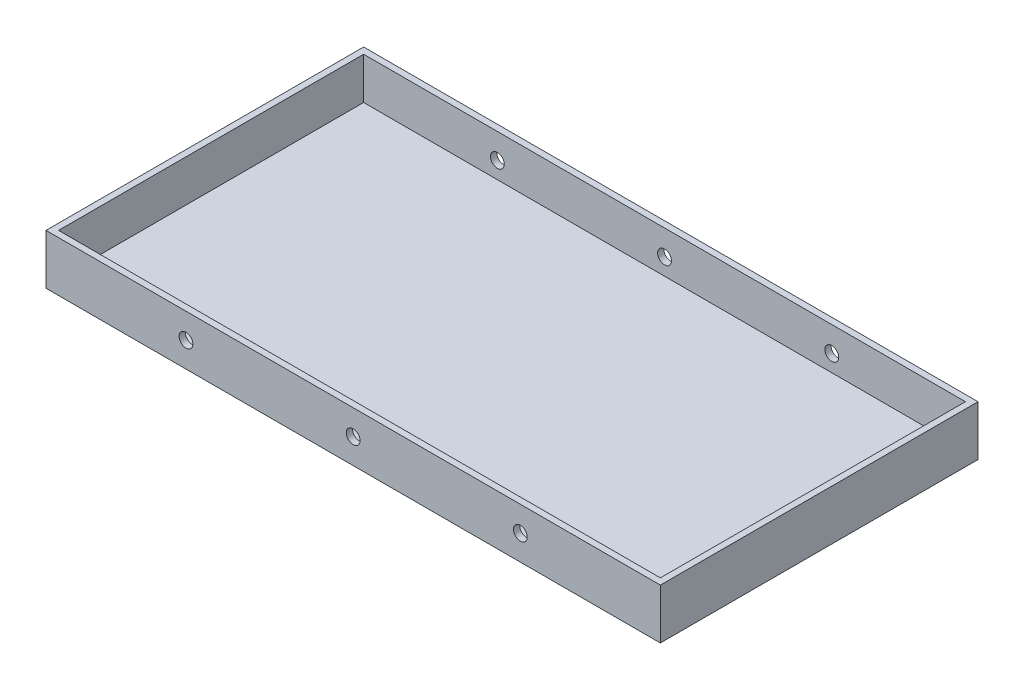
ISO-10303-21;
HEADER;
FILE_DESCRIPTION(('STEP AP214'),'2;1');
FILE_NAME('part.step','',(''),(''),'','','');
FILE_SCHEMA(('AUTOMOTIVE_DESIGN { 1 0 10303 214 1 1 1 1 }'));
ENDSEC;
DATA;
#1=APPLICATION_CONTEXT('core data for automotive mechanical design processes');
#2=APPLICATION_PROTOCOL_DEFINITION('international standard','automotive_design',2000,#1);
#3=PRODUCT_CONTEXT('',#1,'mechanical');
#4=PRODUCT('Part','Part','',(#3));
#5=PRODUCT_RELATED_PRODUCT_CATEGORY('part','',(#4));
#6=PRODUCT_DEFINITION_FORMATION('','',#4);
#7=PRODUCT_DEFINITION_CONTEXT('part definition',#1,'design');
#8=PRODUCT_DEFINITION('design','',#6,#7);
#9=PRODUCT_DEFINITION_SHAPE('','',#8);
#10=(LENGTH_UNIT() NAMED_UNIT(*) SI_UNIT(.MILLI.,.METRE.));
#11=(NAMED_UNIT(*) PLANE_ANGLE_UNIT() SI_UNIT($,.RADIAN.));
#12=(NAMED_UNIT(*) SI_UNIT($,.STERADIAN.) SOLID_ANGLE_UNIT());
#13=UNCERTAINTY_MEASURE_WITH_UNIT(LENGTH_MEASURE(1.E-05),#10,'distance_accuracy_value','');
#14=(GEOMETRIC_REPRESENTATION_CONTEXT(3) GLOBAL_UNCERTAINTY_ASSIGNED_CONTEXT((#13)) GLOBAL_UNIT_ASSIGNED_CONTEXT((#10,
#11,#12)) REPRESENTATION_CONTEXT('',''));
#15=CARTESIAN_POINT('',(0.,0.,0.));
#16=DIRECTION('',(0.,0.,1.));
#17=DIRECTION('',(1.,0.,0.));
#18=AXIS2_PLACEMENT_3D('',#15,#16,#17);
#19=CARTESIAN_POINT('',(0.,12.,0.));
#20=DIRECTION('',(1.,0.,0.));
#21=DIRECTION('',(0.,0.,-1.));
#22=AXIS2_PLACEMENT_3D('',#19,#20,#21);
#23=PLANE('',#22);
#24=DIRECTION('',(0.,0.,1.));
#25=VECTOR('',#24,1.);
#26=CARTESIAN_POINT('',(0.,0.,0.));
#27=LINE('',#26,#25);
#28=CARTESIAN_POINT('',(0.,0.,-76.));
#29=VERTEX_POINT('',#28);
#30=CARTESIAN_POINT('',(0.,0.,0.));
#31=VERTEX_POINT('',#30);
#32=EDGE_CURVE('E150',#29,#31,#27,.T.);
#33=ORIENTED_EDGE('',*,*,#32,.T.);
#34=DIRECTION('',(0.,-1.,0.));
#35=VECTOR('',#34,1.);
#36=CARTESIAN_POINT('',(0.,12.,0.));
#37=LINE('',#36,#35);
#38=CARTESIAN_POINT('',(0.,12.,0.));
#39=VERTEX_POINT('',#38);
#40=EDGE_CURVE('E12',#39,#31,#37,.T.);
#41=ORIENTED_EDGE('',*,*,#40,.F.);
#42=DIRECTION('',(0.,0.,1.));
#43=VECTOR('',#42,1.);
#44=CARTESIAN_POINT('',(0.,12.,0.));
#45=LINE('',#44,#43);
#46=CARTESIAN_POINT('',(0.,12.,-76.));
#47=VERTEX_POINT('',#46);
#48=EDGE_CURVE('E151',#47,#39,#45,.T.);
#49=ORIENTED_EDGE('',*,*,#48,.F.);
#50=DIRECTION('',(0.,-1.,0.));
#51=VECTOR('',#50,1.);
#52=CARTESIAN_POINT('',(0.,12.,-76.));
#53=LINE('',#52,#51);
#54=EDGE_CURVE('E157',#47,#29,#53,.T.);
#55=ORIENTED_EDGE('',*,*,#54,.T.);
#56=EDGE_LOOP('',(#33,#41,#49,#55));
#57=FACE_BOUND('',#56,.T.);
#58=ADVANCED_FACE('F37',(#57),#23,.F.);
#59=CARTESIAN_POINT('',(0.,12.,0.));
#60=DIRECTION('',(0.,0.,-1.));
#61=DIRECTION('',(-1.,0.,0.));
#62=AXIS2_PLACEMENT_3D('',#59,#60,#61);
#63=PLANE('',#62);
#64=CARTESIAN_POINT('',(113.5,6.,0.));
#65=DIRECTION('',(0.,0.,-1.));
#66=DIRECTION('',(-1.,0.,0.));
#67=AXIS2_PLACEMENT_3D('',#64,#65,#66);
#68=CIRCLE('',#67,1.65);
#69=CARTESIAN_POINT('',(111.85,6.,0.));
#70=VERTEX_POINT('',#69);
#71=EDGE_CURVE('E173',#70,#70,#68,.T.);
#72=ORIENTED_EDGE('',*,*,#71,.T.);
#73=EDGE_LOOP('',(#72));
#74=FACE_BOUND('',#73,.T.);
#75=CARTESIAN_POINT('',(33.5,6.,0.));
#76=DIRECTION('',(0.,0.,-1.));
#77=DIRECTION('',(1.,0.,0.));
#78=AXIS2_PLACEMENT_3D('',#75,#76,#77);
#79=CIRCLE('',#78,1.65);
#80=CARTESIAN_POINT('',(35.15,6.,0.));
#81=VERTEX_POINT('',#80);
#82=EDGE_CURVE('E250',#81,#81,#79,.T.);
#83=ORIENTED_EDGE('',*,*,#82,.T.);
#84=EDGE_LOOP('',(#83));
#85=FACE_BOUND('',#84,.T.);
#86=CARTESIAN_POINT('',(73.5,6.,0.));
#87=DIRECTION('',(0.,0.,-1.));
#88=DIRECTION('',(-1.,0.,0.));
#89=AXIS2_PLACEMENT_3D('',#86,#87,#88);
#90=CIRCLE('',#89,1.65);
#91=CARTESIAN_POINT('',(71.85,6.,0.));
#92=VERTEX_POINT('',#91);
#93=EDGE_CURVE('E246',#92,#92,#90,.T.);
#94=ORIENTED_EDGE('',*,*,#93,.T.);
#95=EDGE_LOOP('',(#94));
#96=FACE_BOUND('',#95,.T.);
#97=DIRECTION('',(1.,0.,0.));
#98=VECTOR('',#97,1.);
#99=CARTESIAN_POINT('',(0.,0.,0.));
#100=LINE('',#99,#98);
#101=CARTESIAN_POINT('',(147.,0.,0.));
#102=VERTEX_POINT('',#101);
#103=EDGE_CURVE('E160',#31,#102,#100,.T.);
#104=ORIENTED_EDGE('',*,*,#103,.T.);
#105=DIRECTION('',(0.,-1.,0.));
#106=VECTOR('',#105,1.);
#107=CARTESIAN_POINT('',(147.,12.,0.));
#108=LINE('',#107,#106);
#109=CARTESIAN_POINT('',(147.,12.,0.));
#110=VERTEX_POINT('',#109);
#111=EDGE_CURVE('E45',#110,#102,#108,.T.);
#112=ORIENTED_EDGE('',*,*,#111,.F.);
#113=DIRECTION('',(1.,0.,0.));
#114=VECTOR('',#113,1.);
#115=CARTESIAN_POINT('',(0.,12.,0.));
#116=LINE('',#115,#114);
#117=EDGE_CURVE('E90',#39,#110,#116,.T.);
#118=ORIENTED_EDGE('',*,*,#117,.F.);
#119=ORIENTED_EDGE('',*,*,#40,.T.);
#120=EDGE_LOOP('',(#104,#112,#118,#119));
#121=FACE_BOUND('',#120,.T.);
#122=ADVANCED_FACE('F206',(#74,#85,#96,#121),#63,.F.);
#123=CARTESIAN_POINT('',(147.,12.,0.));
#124=DIRECTION('',(-1.,0.,0.));
#125=DIRECTION('',(0.,0.,1.));
#126=AXIS2_PLACEMENT_3D('',#123,#124,#125);
#127=PLANE('',#126);
#128=DIRECTION('',(0.,0.,-1.));
#129=VECTOR('',#128,1.);
#130=CARTESIAN_POINT('',(147.,0.,0.));
#131=LINE('',#130,#129);
#132=CARTESIAN_POINT('',(147.,0.,-76.));
#133=VERTEX_POINT('',#132);
#134=EDGE_CURVE('E162',#102,#133,#131,.T.);
#135=ORIENTED_EDGE('',*,*,#134,.T.);
#136=DIRECTION('',(0.,-1.,0.));
#137=VECTOR('',#136,1.);
#138=CARTESIAN_POINT('',(147.,12.,-76.));
#139=LINE('',#138,#137);
#140=CARTESIAN_POINT('',(147.,12.,-76.));
#141=VERTEX_POINT('',#140);
#142=EDGE_CURVE('E166',#141,#133,#139,.T.);
#143=ORIENTED_EDGE('',*,*,#142,.F.);
#144=DIRECTION('',(0.,0.,-1.));
#145=VECTOR('',#144,1.);
#146=CARTESIAN_POINT('',(147.,12.,0.));
#147=LINE('',#146,#145);
#148=EDGE_CURVE('E154',#110,#141,#147,.T.);
#149=ORIENTED_EDGE('',*,*,#148,.F.);
#150=ORIENTED_EDGE('',*,*,#111,.T.);
#151=EDGE_LOOP('',(#135,#143,#149,#150));
#152=FACE_BOUND('',#151,.T.);
#153=ADVANCED_FACE('F211',(#152),#127,.F.);
#154=CARTESIAN_POINT('',(0.,12.,-76.));
#155=DIRECTION('',(0.,0.,1.));
#156=DIRECTION('',(1.,0.,0.));
#157=AXIS2_PLACEMENT_3D('',#154,#155,#156);
#158=PLANE('',#157);
#159=CARTESIAN_POINT('',(113.5,6.,-76.));
#160=DIRECTION('',(0.,0.,-1.));
#161=DIRECTION('',(-1.,0.,0.));
#162=AXIS2_PLACEMENT_3D('',#159,#160,#161);
#163=CIRCLE('',#162,1.65);
#164=CARTESIAN_POINT('',(111.85,6.,-76.));
#165=VERTEX_POINT('',#164);
#166=EDGE_CURVE('E238',#165,#165,#163,.T.);
#167=ORIENTED_EDGE('',*,*,#166,.F.);
#168=EDGE_LOOP('',(#167));
#169=FACE_BOUND('',#168,.T.);
#170=CARTESIAN_POINT('',(33.5,6.,-76.));
#171=DIRECTION('',(0.,0.,-1.));
#172=DIRECTION('',(1.,0.,0.));
#173=AXIS2_PLACEMENT_3D('',#170,#171,#172);
#174=CIRCLE('',#173,1.65);
#175=CARTESIAN_POINT('',(35.15,6.,-76.));
#176=VERTEX_POINT('',#175);
#177=EDGE_CURVE('E242',#176,#176,#174,.T.);
#178=ORIENTED_EDGE('',*,*,#177,.F.);
#179=EDGE_LOOP('',(#178));
#180=FACE_BOUND('',#179,.T.);
#181=CARTESIAN_POINT('',(73.5,6.,-76.));
#182=DIRECTION('',(0.,0.,-1.));
#183=DIRECTION('',(-1.,0.,0.));
#184=AXIS2_PLACEMENT_3D('',#181,#182,#183);
#185=CIRCLE('',#184,1.65);
#186=CARTESIAN_POINT('',(71.85,6.,-76.));
#187=VERTEX_POINT('',#186);
#188=EDGE_CURVE('E186',#187,#187,#185,.T.);
#189=ORIENTED_EDGE('',*,*,#188,.F.);
#190=EDGE_LOOP('',(#189));
#191=FACE_BOUND('',#190,.T.);
#192=DIRECTION('',(-1.,0.,0.));
#193=VECTOR('',#192,1.);
#194=CARTESIAN_POINT('',(0.,0.,-76.));
#195=LINE('',#194,#193);
#196=EDGE_CURVE('E83',#133,#29,#195,.T.);
#197=ORIENTED_EDGE('',*,*,#196,.T.);
#198=ORIENTED_EDGE('',*,*,#54,.F.);
#199=DIRECTION('',(-1.,0.,0.));
#200=VECTOR('',#199,1.);
#201=CARTESIAN_POINT('',(0.,12.,-76.));
#202=LINE('',#201,#200);
#203=EDGE_CURVE('E62',#141,#47,#202,.T.);
#204=ORIENTED_EDGE('',*,*,#203,.F.);
#205=ORIENTED_EDGE('',*,*,#142,.T.);
#206=EDGE_LOOP('',(#197,#198,#204,#205));
#207=FACE_BOUND('',#206,.T.);
#208=ADVANCED_FACE('F200',(#169,#180,#191,#207),#158,.F.);
#209=CARTESIAN_POINT('',(0.,12.,0.));
#210=DIRECTION('',(0.,-1.,0.));
#211=DIRECTION('',(0.,0.,-1.));
#212=AXIS2_PLACEMENT_3D('',#209,#210,#211);
#213=PLANE('',#212);
#214=DIRECTION('',(1.,0.,0.));
#215=VECTOR('',#214,1.);
#216=CARTESIAN_POINT('',(1.5,12.,-1.5));
#217=LINE('',#216,#215);
#218=CARTESIAN_POINT('',(1.5,12.,-1.5));
#219=VERTEX_POINT('',#218);
#220=CARTESIAN_POINT('',(145.5,12.,-1.5));
#221=VERTEX_POINT('',#220);
#222=EDGE_CURVE('E136',#219,#221,#217,.T.);
#223=ORIENTED_EDGE('',*,*,#222,.F.);
#224=DIRECTION('',(0.,0.,1.));
#225=VECTOR('',#224,1.);
#226=CARTESIAN_POINT('',(1.5,12.,-74.5));
#227=LINE('',#226,#225);
#228=CARTESIAN_POINT('',(1.5,12.,-74.5));
#229=VERTEX_POINT('',#228);
#230=EDGE_CURVE('E129',#229,#219,#227,.T.);
#231=ORIENTED_EDGE('',*,*,#230,.F.);
#232=DIRECTION('',(-1.,0.,0.));
#233=VECTOR('',#232,1.);
#234=CARTESIAN_POINT('',(145.5,12.,-74.5));
#235=LINE('',#234,#233);
#236=CARTESIAN_POINT('',(145.5,12.,-74.5));
#237=VERTEX_POINT('',#236);
#238=EDGE_CURVE('E140',#237,#229,#235,.T.);
#239=ORIENTED_EDGE('',*,*,#238,.F.);
#240=DIRECTION('',(0.,0.,-1.));
#241=VECTOR('',#240,1.);
#242=CARTESIAN_POINT('',(145.5,12.,-1.5));
#243=LINE('',#242,#241);
#244=EDGE_CURVE('E53',#221,#237,#243,.T.);
#245=ORIENTED_EDGE('',*,*,#244,.F.);
#246=EDGE_LOOP('',(#223,#231,#239,#245));
#247=FACE_BOUND('',#246,.T.);
#248=ORIENTED_EDGE('',*,*,#48,.T.);
#249=ORIENTED_EDGE('',*,*,#117,.T.);
#250=ORIENTED_EDGE('',*,*,#148,.T.);
#251=ORIENTED_EDGE('',*,*,#203,.T.);
#252=EDGE_LOOP('',(#248,#249,#250,#251));
#253=FACE_BOUND('',#252,.T.);
#254=ADVANCED_FACE('F197',(#247,#253),#213,.F.);
#255=CARTESIAN_POINT('',(0.,0.,0.));
#256=DIRECTION('',(0.,-1.,0.));
#257=DIRECTION('',(0.,0.,-1.));
#258=AXIS2_PLACEMENT_3D('',#255,#256,#257);
#259=PLANE('',#258);
#260=ORIENTED_EDGE('',*,*,#32,.F.);
#261=ORIENTED_EDGE('',*,*,#196,.F.);
#262=ORIENTED_EDGE('',*,*,#134,.F.);
#263=ORIENTED_EDGE('',*,*,#103,.F.);
#264=EDGE_LOOP('',(#260,#261,#262,#263));
#265=FACE_BOUND('',#264,.T.);
#266=ADVANCED_FACE('F199',(#265),#259,.T.);
#267=CARTESIAN_POINT('',(0.,2.,0.));
#268=DIRECTION('',(0.,-1.,0.));
#269=DIRECTION('',(0.,0.,-1.));
#270=AXIS2_PLACEMENT_3D('',#267,#268,#269);
#271=PLANE('',#270);
#272=DIRECTION('',(-1.,0.,0.));
#273=VECTOR('',#272,1.);
#274=CARTESIAN_POINT('',(145.5,2.,-74.5));
#275=LINE('',#274,#273);
#276=CARTESIAN_POINT('',(145.5,2.,-74.5));
#277=VERTEX_POINT('',#276);
#278=CARTESIAN_POINT('',(1.5,2.,-74.5));
#279=VERTEX_POINT('',#278);
#280=EDGE_CURVE('E133',#277,#279,#275,.T.);
#281=ORIENTED_EDGE('',*,*,#280,.T.);
#282=DIRECTION('',(0.,0.,1.));
#283=VECTOR('',#282,1.);
#284=CARTESIAN_POINT('',(1.5,2.,-74.5));
#285=LINE('',#284,#283);
#286=CARTESIAN_POINT('',(1.5,2.,-1.5));
#287=VERTEX_POINT('',#286);
#288=EDGE_CURVE('E126',#279,#287,#285,.T.);
#289=ORIENTED_EDGE('',*,*,#288,.T.);
#290=DIRECTION('',(1.,0.,0.));
#291=VECTOR('',#290,1.);
#292=CARTESIAN_POINT('',(1.5,2.,-1.5));
#293=LINE('',#292,#291);
#294=CARTESIAN_POINT('',(145.5,2.,-1.5));
#295=VERTEX_POINT('',#294);
#296=EDGE_CURVE('E113',#287,#295,#293,.T.);
#297=ORIENTED_EDGE('',*,*,#296,.T.);
#298=DIRECTION('',(0.,0.,-1.));
#299=VECTOR('',#298,1.);
#300=CARTESIAN_POINT('',(145.5,2.,-1.5));
#301=LINE('',#300,#299);
#302=EDGE_CURVE('E145',#295,#277,#301,.T.);
#303=ORIENTED_EDGE('',*,*,#302,.T.);
#304=EDGE_LOOP('',(#281,#289,#297,#303));
#305=FACE_BOUND('',#304,.T.);
#306=ADVANCED_FACE('F132',(#305),#271,.F.);
#307=CARTESIAN_POINT('',(1.5,-161.446585594122,-74.5));
#308=DIRECTION('',(-1.,0.,0.));
#309=DIRECTION('',(0.,0.,1.));
#310=AXIS2_PLACEMENT_3D('',#307,#308,#309);
#311=PLANE('',#310);
#312=DIRECTION('',(0.,1.,0.));
#313=VECTOR('',#312,1.);
#314=CARTESIAN_POINT('',(1.5,-161.446585594122,-74.5));
#315=LINE('',#314,#313);
#316=EDGE_CURVE('E143',#279,#229,#315,.T.);
#317=ORIENTED_EDGE('',*,*,#316,.T.);
#318=ORIENTED_EDGE('',*,*,#230,.T.);
#319=DIRECTION('',(0.,1.,0.));
#320=VECTOR('',#319,1.);
#321=CARTESIAN_POINT('',(1.5,-161.446585594122,-1.5));
#322=LINE('',#321,#320);
#323=EDGE_CURVE('E117',#287,#219,#322,.T.);
#324=ORIENTED_EDGE('',*,*,#323,.F.);
#325=ORIENTED_EDGE('',*,*,#288,.F.);
#326=EDGE_LOOP('',(#317,#318,#324,#325));
#327=FACE_BOUND('',#326,.T.);
#328=ADVANCED_FACE('F125',(#327),#311,.F.);
#329=CARTESIAN_POINT('',(1.5,-161.446585594122,-1.5));
#330=DIRECTION('',(0.,0.,1.));
#331=DIRECTION('',(1.,0.,0.));
#332=AXIS2_PLACEMENT_3D('',#329,#330,#331);
#333=PLANE('',#332);
#334=CARTESIAN_POINT('',(113.5,6.,-1.5));
#335=DIRECTION('',(0.,0.,1.));
#336=DIRECTION('',(1.,0.,0.));
#337=AXIS2_PLACEMENT_3D('',#334,#335,#336);
#338=CIRCLE('',#337,1.65);
#339=CARTESIAN_POINT('',(115.15,6.,-1.5));
#340=VERTEX_POINT('',#339);
#341=EDGE_CURVE('E189',#340,#340,#338,.T.);
#342=ORIENTED_EDGE('',*,*,#341,.T.);
#343=EDGE_LOOP('',(#342));
#344=FACE_BOUND('',#343,.T.);
#345=CARTESIAN_POINT('',(33.5,6.,-1.5));
#346=DIRECTION('',(0.,0.,1.));
#347=DIRECTION('',(1.,0.,0.));
#348=AXIS2_PLACEMENT_3D('',#345,#346,#347);
#349=CIRCLE('',#348,1.65);
#350=CARTESIAN_POINT('',(35.15,6.,-1.5));
#351=VERTEX_POINT('',#350);
#352=EDGE_CURVE('E176',#351,#351,#349,.T.);
#353=ORIENTED_EDGE('',*,*,#352,.T.);
#354=EDGE_LOOP('',(#353));
#355=FACE_BOUND('',#354,.T.);
#356=CARTESIAN_POINT('',(73.5,6.,-1.5));
#357=DIRECTION('',(0.,0.,1.));
#358=DIRECTION('',(1.,0.,0.));
#359=AXIS2_PLACEMENT_3D('',#356,#357,#358);
#360=CIRCLE('',#359,1.65);
#361=CARTESIAN_POINT('',(75.15,6.,-1.5));
#362=VERTEX_POINT('',#361);
#363=EDGE_CURVE('E172',#362,#362,#360,.T.);
#364=ORIENTED_EDGE('',*,*,#363,.T.);
#365=EDGE_LOOP('',(#364));
#366=FACE_BOUND('',#365,.T.);
#367=ORIENTED_EDGE('',*,*,#323,.T.);
#368=ORIENTED_EDGE('',*,*,#222,.T.);
#369=DIRECTION('',(0.,1.,0.));
#370=VECTOR('',#369,1.);
#371=CARTESIAN_POINT('',(145.5,-161.446585594122,-1.5));
#372=LINE('',#371,#370);
#373=EDGE_CURVE('E119',#295,#221,#372,.T.);
#374=ORIENTED_EDGE('',*,*,#373,.F.);
#375=ORIENTED_EDGE('',*,*,#296,.F.);
#376=EDGE_LOOP('',(#367,#368,#374,#375));
#377=FACE_BOUND('',#376,.T.);
#378=ADVANCED_FACE('F115',(#344,#355,#366,#377),#333,.F.);
#379=CARTESIAN_POINT('',(145.5,-161.446585594122,-1.5));
#380=DIRECTION('',(1.,0.,0.));
#381=DIRECTION('',(0.,0.,-1.));
#382=AXIS2_PLACEMENT_3D('',#379,#380,#381);
#383=PLANE('',#382);
#384=ORIENTED_EDGE('',*,*,#373,.T.);
#385=ORIENTED_EDGE('',*,*,#244,.T.);
#386=DIRECTION('',(0.,1.,0.));
#387=VECTOR('',#386,1.);
#388=CARTESIAN_POINT('',(145.5,-161.446585594122,-74.5));
#389=LINE('',#388,#387);
#390=EDGE_CURVE('E144',#277,#237,#389,.T.);
#391=ORIENTED_EDGE('',*,*,#390,.F.);
#392=ORIENTED_EDGE('',*,*,#302,.F.);
#393=EDGE_LOOP('',(#384,#385,#391,#392));
#394=FACE_BOUND('',#393,.T.);
#395=ADVANCED_FACE('F268',(#394),#383,.F.);
#396=CARTESIAN_POINT('',(145.5,-161.446585594122,-74.5));
#397=DIRECTION('',(0.,0.,-1.));
#398=DIRECTION('',(-1.,0.,0.));
#399=AXIS2_PLACEMENT_3D('',#396,#397,#398);
#400=PLANE('',#399);
#401=CARTESIAN_POINT('',(113.5,6.,-74.5));
#402=DIRECTION('',(0.,0.,-1.));
#403=DIRECTION('',(-1.,0.,0.));
#404=AXIS2_PLACEMENT_3D('',#401,#402,#403);
#405=CIRCLE('',#404,1.65);
#406=CARTESIAN_POINT('',(111.85,6.,-74.5));
#407=VERTEX_POINT('',#406);
#408=EDGE_CURVE('E40',#407,#407,#405,.T.);
#409=ORIENTED_EDGE('',*,*,#408,.T.);
#410=EDGE_LOOP('',(#409));
#411=FACE_BOUND('',#410,.T.);
#412=CARTESIAN_POINT('',(33.5,6.,-74.5));
#413=DIRECTION('',(0.,0.,-1.));
#414=DIRECTION('',(-1.,0.,0.));
#415=AXIS2_PLACEMENT_3D('',#412,#413,#414);
#416=CIRCLE('',#415,1.65);
#417=CARTESIAN_POINT('',(31.85,6.,-74.5));
#418=VERTEX_POINT('',#417);
#419=EDGE_CURVE('E174',#418,#418,#416,.T.);
#420=ORIENTED_EDGE('',*,*,#419,.T.);
#421=EDGE_LOOP('',(#420));
#422=FACE_BOUND('',#421,.T.);
#423=CARTESIAN_POINT('',(73.5,6.,-74.5));
#424=DIRECTION('',(0.,0.,-1.));
#425=DIRECTION('',(-1.,0.,0.));
#426=AXIS2_PLACEMENT_3D('',#423,#424,#425);
#427=CIRCLE('',#426,1.65);
#428=CARTESIAN_POINT('',(71.85,6.,-74.5));
#429=VERTEX_POINT('',#428);
#430=EDGE_CURVE('E170',#429,#429,#427,.T.);
#431=ORIENTED_EDGE('',*,*,#430,.T.);
#432=EDGE_LOOP('',(#431));
#433=FACE_BOUND('',#432,.T.);
#434=ORIENTED_EDGE('',*,*,#390,.T.);
#435=ORIENTED_EDGE('',*,*,#238,.T.);
#436=ORIENTED_EDGE('',*,*,#316,.F.);
#437=ORIENTED_EDGE('',*,*,#280,.F.);
#438=EDGE_LOOP('',(#434,#435,#436,#437));
#439=FACE_BOUND('',#438,.T.);
#440=ADVANCED_FACE('F195',(#411,#422,#433,#439),#400,.F.);
#441=CARTESIAN_POINT('',(73.5,6.,0.));
#442=DIRECTION('',(0.,0.,-1.));
#443=DIRECTION('',(-1.,0.,0.));
#444=AXIS2_PLACEMENT_3D('',#441,#442,#443);
#445=CYLINDRICAL_SURFACE('',#444,1.65);
#446=ORIENTED_EDGE('',*,*,#188,.T.);
#447=EDGE_LOOP('',(#446));
#448=FACE_BOUND('',#447,.T.);
#449=ORIENTED_EDGE('',*,*,#430,.F.);
#450=EDGE_LOOP('',(#449));
#451=FACE_BOUND('',#450,.T.);
#452=ADVANCED_FACE('F282',(#448,#451),#445,.F.);
#453=CARTESIAN_POINT('',(33.5,6.,0.));
#454=DIRECTION('',(0.,0.,-1.));
#455=DIRECTION('',(-1.,0.,0.));
#456=AXIS2_PLACEMENT_3D('',#453,#454,#455);
#457=CYLINDRICAL_SURFACE('',#456,1.65);
#458=ORIENTED_EDGE('',*,*,#177,.T.);
#459=EDGE_LOOP('',(#458));
#460=FACE_BOUND('',#459,.T.);
#461=ORIENTED_EDGE('',*,*,#419,.F.);
#462=EDGE_LOOP('',(#461));
#463=FACE_BOUND('',#462,.T.);
#464=ADVANCED_FACE('F276',(#460,#463),#457,.F.);
#465=CARTESIAN_POINT('',(113.5,6.,0.));
#466=DIRECTION('',(0.,0.,-1.));
#467=DIRECTION('',(-1.,0.,0.));
#468=AXIS2_PLACEMENT_3D('',#465,#466,#467);
#469=CYLINDRICAL_SURFACE('',#468,1.65);
#470=ORIENTED_EDGE('',*,*,#166,.T.);
#471=EDGE_LOOP('',(#470));
#472=FACE_BOUND('',#471,.T.);
#473=ORIENTED_EDGE('',*,*,#408,.F.);
#474=EDGE_LOOP('',(#473));
#475=FACE_BOUND('',#474,.T.);
#476=ADVANCED_FACE('F263',(#472,#475),#469,.F.);
#477=ORIENTED_EDGE('',*,*,#93,.F.);
#478=EDGE_LOOP('',(#477));
#479=FACE_BOUND('',#478,.T.);
#480=ORIENTED_EDGE('',*,*,#363,.F.);
#481=EDGE_LOOP('',(#480));
#482=FACE_BOUND('',#481,.T.);
#483=ADVANCED_FACE('F273',(#479,#482),#445,.F.);
#484=ORIENTED_EDGE('',*,*,#82,.F.);
#485=EDGE_LOOP('',(#484));
#486=FACE_BOUND('',#485,.T.);
#487=ORIENTED_EDGE('',*,*,#352,.F.);
#488=EDGE_LOOP('',(#487));
#489=FACE_BOUND('',#488,.T.);
#490=ADVANCED_FACE('F261',(#486,#489),#457,.F.);
#491=ORIENTED_EDGE('',*,*,#71,.F.);
#492=EDGE_LOOP('',(#491));
#493=FACE_BOUND('',#492,.T.);
#494=ORIENTED_EDGE('',*,*,#341,.F.);
#495=EDGE_LOOP('',(#494));
#496=FACE_BOUND('',#495,.T.);
#497=ADVANCED_FACE('F258',(#493,#496),#469,.F.);
#498=CLOSED_SHELL('',(#58,#122,#153,#208,#254,#266,#306,#328,#378,#395,#440,#452,#464,#476,#483,
#490,#497));
#499=MANIFOLD_SOLID_BREP('B2',#498);
#500=ADVANCED_BREP_SHAPE_REPRESENTATION('',(#18,#499),#14);
#501=SHAPE_DEFINITION_REPRESENTATION(#9,#500);
ENDSEC;
END-ISO-10303-21;
